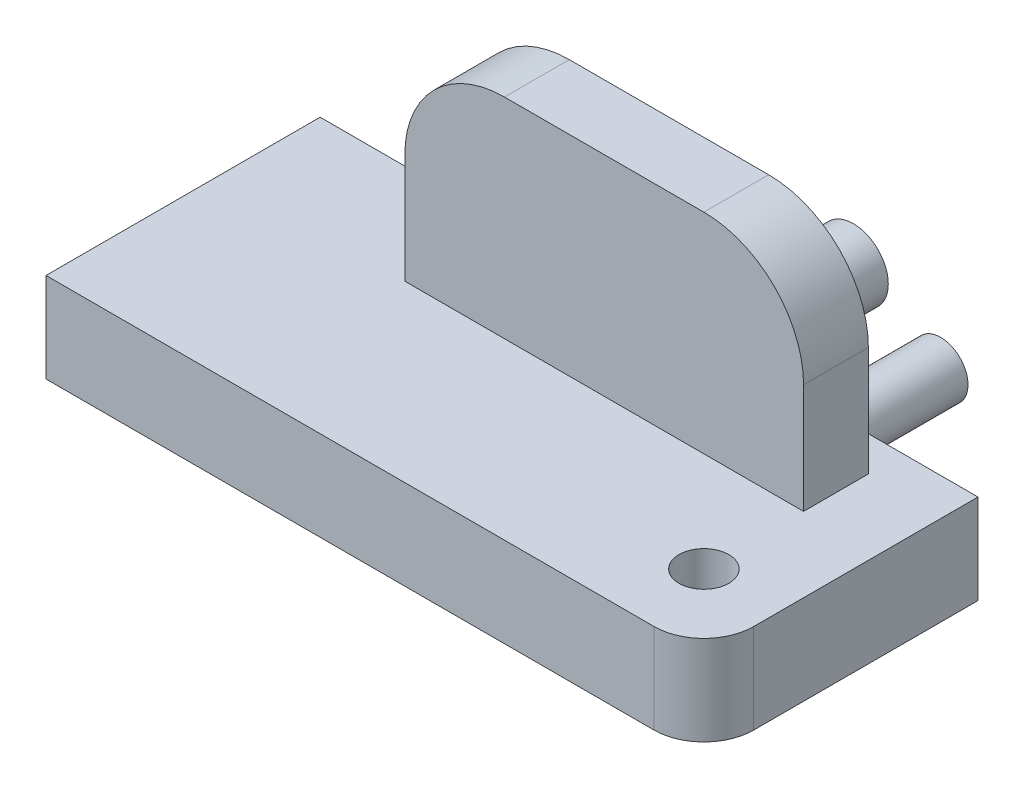
ISO-10303-21;
HEADER;
FILE_DESCRIPTION(('STEP AP214'),'2;1');
FILE_NAME('part.step','',(''),(''),'','','');
FILE_SCHEMA(('AUTOMOTIVE_DESIGN { 1 0 10303 214 1 1 1 1 }'));
ENDSEC;
DATA;
#1=APPLICATION_CONTEXT('core data for automotive mechanical design processes');
#2=APPLICATION_PROTOCOL_DEFINITION('international standard','automotive_design',2000,#1);
#3=PRODUCT_CONTEXT('',#1,'mechanical');
#4=PRODUCT('Part','Part','',(#3));
#5=PRODUCT_RELATED_PRODUCT_CATEGORY('part','',(#4));
#6=PRODUCT_DEFINITION_FORMATION('','',#4);
#7=PRODUCT_DEFINITION_CONTEXT('part definition',#1,'design');
#8=PRODUCT_DEFINITION('design','',#6,#7);
#9=PRODUCT_DEFINITION_SHAPE('','',#8);
#10=(LENGTH_UNIT() NAMED_UNIT(*) SI_UNIT(.MILLI.,.METRE.));
#11=(NAMED_UNIT(*) PLANE_ANGLE_UNIT() SI_UNIT($,.RADIAN.));
#12=(NAMED_UNIT(*) SI_UNIT($,.STERADIAN.) SOLID_ANGLE_UNIT());
#13=UNCERTAINTY_MEASURE_WITH_UNIT(LENGTH_MEASURE(1.E-05),#10,'distance_accuracy_value','');
#14=(GEOMETRIC_REPRESENTATION_CONTEXT(3) GLOBAL_UNCERTAINTY_ASSIGNED_CONTEXT((#13)) GLOBAL_UNIT_ASSIGNED_CONTEXT((#10,
#11,#12)) REPRESENTATION_CONTEXT('',''));
#15=CARTESIAN_POINT('',(0.,0.,0.));
#16=DIRECTION('',(0.,0.,1.));
#17=DIRECTION('',(1.,0.,0.));
#18=AXIS2_PLACEMENT_3D('',#15,#16,#17);
#19=CARTESIAN_POINT('',(50.,8.,-5.));
#20=DIRECTION('',(0.,1.,0.));
#21=DIRECTION('',(0.,0.,1.));
#22=AXIS2_PLACEMENT_3D('',#19,#20,#21);
#23=PLANE('',#22);
#24=DIRECTION('',(-1.,0.,0.));
#25=VECTOR('',#24,1.);
#26=CARTESIAN_POINT('',(0.,8.,-17.5));
#27=LINE('',#26,#25);
#28=CARTESIAN_POINT('',(47.5,8.,-17.5));
#29=VERTEX_POINT('',#28);
#30=CARTESIAN_POINT('',(7.49999999999999,8.,-17.5));
#31=VERTEX_POINT('',#30);
#32=EDGE_CURVE('E195',#29,#31,#27,.T.);
#33=ORIENTED_EDGE('',*,*,#32,.T.);
#34=DIRECTION('',(0.,0.,-1.));
#35=VECTOR('',#34,1.);
#36=CARTESIAN_POINT('',(7.49999999999999,8.,0.));
#37=LINE('',#36,#35);
#38=CARTESIAN_POINT('',(7.49999999999999,8.,-24.));
#39=VERTEX_POINT('',#38);
#40=EDGE_CURVE('E179',#31,#39,#37,.T.);
#41=ORIENTED_EDGE('',*,*,#40,.T.);
#42=DIRECTION('',(-1.,0.,0.));
#43=VECTOR('',#42,1.);
#44=CARTESIAN_POINT('',(0.,8.,-24.));
#45=LINE('',#44,#43);
#46=CARTESIAN_POINT('',(47.5,8.,-24.));
#47=VERTEX_POINT('',#46);
#48=EDGE_CURVE('E193',#47,#39,#45,.T.);
#49=ORIENTED_EDGE('',*,*,#48,.F.);
#50=DIRECTION('',(0.,0.,-1.));
#51=VECTOR('',#50,1.);
#52=CARTESIAN_POINT('',(47.5,8.,0.));
#53=LINE('',#52,#51);
#54=EDGE_CURVE('E172',#29,#47,#53,.T.);
#55=ORIENTED_EDGE('',*,*,#54,.F.);
#56=EDGE_LOOP('',(#33,#41,#49,#55));
#57=FACE_BOUND('',#56,.T.);
#58=DIRECTION('',(1.,0.,0.));
#59=VECTOR('',#58,1.);
#60=CARTESIAN_POINT('',(5.00000000000003,8.,0.));
#61=LINE('',#60,#59);
#62=CARTESIAN_POINT('',(-11.,8.,0.));
#63=VERTEX_POINT('',#62);
#64=CARTESIAN_POINT('',(50.,8.,0.));
#65=VERTEX_POINT('',#64);
#66=EDGE_CURVE('E218',#63,#65,#61,.T.);
#67=ORIENTED_EDGE('',*,*,#66,.T.);
#68=CARTESIAN_POINT('',(50.,8.,-5.));
#69=DIRECTION('',(0.,1.,0.));
#70=DIRECTION('',(0.,0.,1.));
#71=AXIS2_PLACEMENT_3D('',#68,#69,#70);
#72=CIRCLE('',#71,5.);
#73=CARTESIAN_POINT('',(55.,8.,-5.00000000000004));
#74=VERTEX_POINT('',#73);
#75=EDGE_CURVE('E212',#65,#74,#72,.T.);
#76=ORIENTED_EDGE('',*,*,#75,.T.);
#77=DIRECTION('',(0.,0.,-1.));
#78=VECTOR('',#77,1.);
#79=CARTESIAN_POINT('',(55.,8.,-5.00000000000004));
#80=LINE('',#79,#78);
#81=CARTESIAN_POINT('',(55.,8.,-27.5));
#82=VERTEX_POINT('',#81);
#83=EDGE_CURVE('E215',#74,#82,#80,.T.);
#84=ORIENTED_EDGE('',*,*,#83,.T.);
#85=DIRECTION('',(-1.,0.,0.));
#86=VECTOR('',#85,1.);
#87=CARTESIAN_POINT('',(50.,8.,-27.5));
#88=LINE('',#87,#86);
#89=CARTESIAN_POINT('',(-11.,8.,-27.5));
#90=VERTEX_POINT('',#89);
#91=EDGE_CURVE('E233',#82,#90,#88,.T.);
#92=ORIENTED_EDGE('',*,*,#91,.T.);
#93=DIRECTION('',(0.,0.,-1.));
#94=VECTOR('',#93,1.);
#95=CARTESIAN_POINT('',(-11.,8.,-27.5));
#96=LINE('',#95,#94);
#97=EDGE_CURVE('E161',#63,#90,#96,.T.);
#98=ORIENTED_EDGE('',*,*,#97,.F.);
#99=EDGE_LOOP('',(#67,#76,#84,#92,#98));
#100=FACE_BOUND('',#99,.T.);
#101=CARTESIAN_POINT('',(47.5000000000004,8.,-7.5));
#102=DIRECTION('',(0.,1.,0.));
#103=DIRECTION('',(0.,0.,1.));
#104=AXIS2_PLACEMENT_3D('',#101,#102,#103);
#105=CIRCLE('',#104,2.5);
#106=CARTESIAN_POINT('',(47.5000000000004,8.,-5.));
#107=VERTEX_POINT('',#106);
#108=EDGE_CURVE('E146',#107,#107,#105,.T.);
#109=ORIENTED_EDGE('',*,*,#108,.F.);
#110=EDGE_LOOP('',(#109));
#111=FACE_BOUND('',#110,.T.);
#112=ADVANCED_FACE('F49',(#57,#100,#111),#23,.T.);
#113=CARTESIAN_POINT('',(0.,23.,-24.));
#114=DIRECTION('',(0.,0.,1.));
#115=DIRECTION('',(1.,0.,0.));
#116=AXIS2_PLACEMENT_3D('',#113,#114,#115);
#117=PLANE('',#116);
#118=CARTESIAN_POINT('',(17.5,17.,-24.));
#119=DIRECTION('',(0.,0.,1.));
#120=DIRECTION('',(1.,0.,0.));
#121=AXIS2_PLACEMENT_3D('',#118,#119,#120);
#122=CIRCLE('',#121,3.5);
#123=CARTESIAN_POINT('',(21.,17.,-24.));
#124=VERTEX_POINT('',#123);
#125=EDGE_CURVE('E239',#124,#124,#122,.F.);
#126=ORIENTED_EDGE('',*,*,#125,.F.);
#127=EDGE_LOOP('',(#126));
#128=FACE_BOUND('',#127,.T.);
#129=CARTESIAN_POINT('',(37.5,17.,-24.));
#130=DIRECTION('',(0.,0.,1.));
#131=DIRECTION('',(1.,0.,0.));
#132=AXIS2_PLACEMENT_3D('',#129,#130,#131);
#133=CIRCLE('',#132,3.5);
#134=CARTESIAN_POINT('',(41.,17.,-24.));
#135=VERTEX_POINT('',#134);
#136=EDGE_CURVE('E236',#135,#135,#133,.F.);
#137=ORIENTED_EDGE('',*,*,#136,.F.);
#138=EDGE_LOOP('',(#137));
#139=FACE_BOUND('',#138,.T.);
#140=DIRECTION('',(-1.,0.,0.));
#141=VECTOR('',#140,1.);
#142=CARTESIAN_POINT('',(32.,29.,-24.));
#143=LINE('',#142,#141);
#144=CARTESIAN_POINT('',(37.5,29.,-24.));
#145=VERTEX_POINT('',#144);
#146=CARTESIAN_POINT('',(17.5,29.,-24.));
#147=VERTEX_POINT('',#146);
#148=EDGE_CURVE('E187',#145,#147,#143,.T.);
#149=ORIENTED_EDGE('',*,*,#148,.F.);
#150=CARTESIAN_POINT('',(37.5,19.,-24.));
#151=DIRECTION('',(0.,0.,1.));
#152=DIRECTION('',(1.,0.,0.));
#153=AXIS2_PLACEMENT_3D('',#150,#151,#152);
#154=CIRCLE('',#153,10.);
#155=CARTESIAN_POINT('',(47.5,19.,-24.));
#156=VERTEX_POINT('',#155);
#157=EDGE_CURVE('E249',#145,#156,#154,.F.);
#158=ORIENTED_EDGE('',*,*,#157,.T.);
#159=DIRECTION('',(0.,-1.,0.));
#160=VECTOR('',#159,1.);
#161=CARTESIAN_POINT('',(47.5,29.,-24.));
#162=LINE('',#161,#160);
#163=EDGE_CURVE('E177',#156,#47,#162,.T.);
#164=ORIENTED_EDGE('',*,*,#163,.T.);
#165=ORIENTED_EDGE('',*,*,#48,.T.);
#166=DIRECTION('',(0.,-1.,0.));
#167=VECTOR('',#166,1.);
#168=CARTESIAN_POINT('',(7.49999999999999,29.,-24.));
#169=LINE('',#168,#167);
#170=CARTESIAN_POINT('',(7.49999999999999,19.,-24.));
#171=VERTEX_POINT('',#170);
#172=EDGE_CURVE('E182',#171,#39,#169,.T.);
#173=ORIENTED_EDGE('',*,*,#172,.F.);
#174=CARTESIAN_POINT('',(17.5,19.,-24.));
#175=DIRECTION('',(0.,0.,1.));
#176=DIRECTION('',(1.,0.,0.));
#177=AXIS2_PLACEMENT_3D('',#174,#175,#176);
#178=CIRCLE('',#177,10.);
#179=EDGE_CURVE('E247',#171,#147,#178,.F.);
#180=ORIENTED_EDGE('',*,*,#179,.T.);
#181=EDGE_LOOP('',(#149,#158,#164,#165,#173,#180));
#182=FACE_BOUND('',#181,.T.);
#183=ADVANCED_FACE('F263',(#128,#139,#182),#117,.F.);
#184=CARTESIAN_POINT('',(55.,-1.,-5.00000000000004));
#185=DIRECTION('',(1.,0.,0.));
#186=DIRECTION('',(0.,0.,-1.));
#187=AXIS2_PLACEMENT_3D('',#184,#185,#186);
#188=PLANE('',#187);
#189=DIRECTION('',(0.,0.,-1.));
#190=VECTOR('',#189,1.);
#191=CARTESIAN_POINT('',(55.,-1.,-5.00000000000004));
#192=LINE('',#191,#190);
#193=CARTESIAN_POINT('',(55.,-1.,-5.00000000000004));
#194=VERTEX_POINT('',#193);
#195=CARTESIAN_POINT('',(55.,-1.,-27.5));
#196=VERTEX_POINT('',#195);
#197=EDGE_CURVE('E226',#194,#196,#192,.T.);
#198=ORIENTED_EDGE('',*,*,#197,.T.);
#199=DIRECTION('',(0.,-1.,0.));
#200=VECTOR('',#199,1.);
#201=CARTESIAN_POINT('',(55.,26.,-27.5));
#202=LINE('',#201,#200);
#203=EDGE_CURVE('E142',#82,#196,#202,.T.);
#204=ORIENTED_EDGE('',*,*,#203,.F.);
#205=ORIENTED_EDGE('',*,*,#83,.F.);
#206=DIRECTION('',(0.,1.,0.));
#207=VECTOR('',#206,1.);
#208=CARTESIAN_POINT('',(55.,-1.,-5.00000000000004));
#209=LINE('',#208,#207);
#210=EDGE_CURVE('E229',#194,#74,#209,.T.);
#211=ORIENTED_EDGE('',*,*,#210,.F.);
#212=EDGE_LOOP('',(#198,#204,#205,#211));
#213=FACE_BOUND('',#212,.T.);
#214=ADVANCED_FACE('F287',(#213),#188,.T.);
#215=CARTESIAN_POINT('',(50.,-1.,-5.));
#216=DIRECTION('',(0.,1.,0.));
#217=DIRECTION('',(0.,0.,1.));
#218=AXIS2_PLACEMENT_3D('',#215,#216,#217);
#219=PLANE('',#218);
#220=CARTESIAN_POINT('',(47.5000000000004,-1.,-7.5));
#221=DIRECTION('',(0.,1.,0.));
#222=DIRECTION('',(0.,0.,1.));
#223=AXIS2_PLACEMENT_3D('',#220,#221,#222);
#224=CIRCLE('',#223,2.5);
#225=CARTESIAN_POINT('',(47.5000000000004,-1.,-5.));
#226=VERTEX_POINT('',#225);
#227=EDGE_CURVE('E220',#226,#226,#224,.T.);
#228=ORIENTED_EDGE('',*,*,#227,.T.);
#229=EDGE_LOOP('',(#228));
#230=FACE_BOUND('',#229,.T.);
#231=CARTESIAN_POINT('',(50.,-1.,-5.));
#232=DIRECTION('',(0.,1.,0.));
#233=DIRECTION('',(0.,0.,1.));
#234=AXIS2_PLACEMENT_3D('',#231,#232,#233);
#235=CIRCLE('',#234,5.);
#236=CARTESIAN_POINT('',(50.,-1.,0.));
#237=VERTEX_POINT('',#236);
#238=EDGE_CURVE('E223',#237,#194,#235,.T.);
#239=ORIENTED_EDGE('',*,*,#238,.F.);
#240=DIRECTION('',(1.,0.,0.));
#241=VECTOR('',#240,1.);
#242=CARTESIAN_POINT('',(5.00000000000003,-1.,0.));
#243=LINE('',#242,#241);
#244=CARTESIAN_POINT('',(-11.,-1.,0.));
#245=VERTEX_POINT('',#244);
#246=EDGE_CURVE('E152',#245,#237,#243,.T.);
#247=ORIENTED_EDGE('',*,*,#246,.F.);
#248=DIRECTION('',(0.,0.,1.));
#249=VECTOR('',#248,1.);
#250=CARTESIAN_POINT('',(-11.,-1.,-27.5));
#251=LINE('',#250,#249);
#252=CARTESIAN_POINT('',(-11.,-1.,-27.5));
#253=VERTEX_POINT('',#252);
#254=EDGE_CURVE('E149',#253,#245,#251,.T.);
#255=ORIENTED_EDGE('',*,*,#254,.F.);
#256=DIRECTION('',(-1.,0.,0.));
#257=VECTOR('',#256,1.);
#258=CARTESIAN_POINT('',(50.,-1.,-27.5));
#259=LINE('',#258,#257);
#260=EDGE_CURVE('E135',#196,#253,#259,.T.);
#261=ORIENTED_EDGE('',*,*,#260,.F.);
#262=ORIENTED_EDGE('',*,*,#197,.F.);
#263=EDGE_LOOP('',(#239,#247,#255,#261,#262));
#264=FACE_BOUND('',#263,.T.);
#265=ADVANCED_FACE('F151',(#230,#264),#219,.F.);
#266=CARTESIAN_POINT('',(50.,-1.,-5.));
#267=DIRECTION('',(0.,1.,0.));
#268=DIRECTION('',(0.,0.,1.));
#269=AXIS2_PLACEMENT_3D('',#266,#267,#268);
#270=CYLINDRICAL_SURFACE('',#269,5.);
#271=ORIENTED_EDGE('',*,*,#210,.T.);
#272=ORIENTED_EDGE('',*,*,#75,.F.);
#273=DIRECTION('',(0.,1.,0.));
#274=VECTOR('',#273,1.);
#275=CARTESIAN_POINT('',(50.,-1.,0.));
#276=LINE('',#275,#274);
#277=EDGE_CURVE('E230',#237,#65,#276,.T.);
#278=ORIENTED_EDGE('',*,*,#277,.F.);
#279=ORIENTED_EDGE('',*,*,#238,.T.);
#280=EDGE_LOOP('',(#271,#272,#278,#279));
#281=FACE_BOUND('',#280,.T.);
#282=ADVANCED_FACE('F300',(#281),#270,.T.);
#283=CARTESIAN_POINT('',(5.00000000000003,-1.,0.));
#284=DIRECTION('',(0.,0.,1.));
#285=DIRECTION('',(1.,0.,0.));
#286=AXIS2_PLACEMENT_3D('',#283,#284,#285);
#287=PLANE('',#286);
#288=ORIENTED_EDGE('',*,*,#277,.T.);
#289=ORIENTED_EDGE('',*,*,#66,.F.);
#290=DIRECTION('',(0.,1.,0.));
#291=VECTOR('',#290,1.);
#292=CARTESIAN_POINT('',(-11.,-1.,0.));
#293=LINE('',#292,#291);
#294=EDGE_CURVE('E156',#245,#63,#293,.T.);
#295=ORIENTED_EDGE('',*,*,#294,.F.);
#296=ORIENTED_EDGE('',*,*,#246,.T.);
#297=EDGE_LOOP('',(#288,#289,#295,#296));
#298=FACE_BOUND('',#297,.T.);
#299=ADVANCED_FACE('F296',(#298),#287,.T.);
#300=CARTESIAN_POINT('',(47.5000000000004,-1.,-7.5));
#301=DIRECTION('',(0.,1.,0.));
#302=DIRECTION('',(0.,0.,1.));
#303=AXIS2_PLACEMENT_3D('',#300,#301,#302);
#304=CYLINDRICAL_SURFACE('',#303,2.5);
#305=ORIENTED_EDGE('',*,*,#227,.F.);
#306=EDGE_LOOP('',(#305));
#307=FACE_BOUND('',#306,.T.);
#308=ORIENTED_EDGE('',*,*,#108,.T.);
#309=EDGE_LOOP('',(#308));
#310=FACE_BOUND('',#309,.T.);
#311=ADVANCED_FACE('F293',(#307,#310),#304,.F.);
#312=CARTESIAN_POINT('',(0.,26.,-27.5));
#313=DIRECTION('',(0.,0.,-1.));
#314=DIRECTION('',(-1.,0.,0.));
#315=AXIS2_PLACEMENT_3D('',#312,#313,#314);
#316=PLANE('',#315);
#317=ORIENTED_EDGE('',*,*,#260,.T.);
#318=DIRECTION('',(0.,-1.,0.));
#319=VECTOR('',#318,1.);
#320=CARTESIAN_POINT('',(-11.,-1.,-27.5));
#321=LINE('',#320,#319);
#322=EDGE_CURVE('E140',#90,#253,#321,.T.);
#323=ORIENTED_EDGE('',*,*,#322,.F.);
#324=ORIENTED_EDGE('',*,*,#91,.F.);
#325=ORIENTED_EDGE('',*,*,#203,.T.);
#326=EDGE_LOOP('',(#317,#323,#324,#325));
#327=FACE_BOUND('',#326,.T.);
#328=CARTESIAN_POINT('',(17.5,3.5,-27.5));
#329=DIRECTION('',(0.,0.,-1.));
#330=DIRECTION('',(-1.,0.,0.));
#331=AXIS2_PLACEMENT_3D('',#328,#329,#330);
#332=CIRCLE('',#331,2.75);
#333=CARTESIAN_POINT('',(14.75,3.5,-27.5));
#334=VERTEX_POINT('',#333);
#335=EDGE_CURVE('E197',#334,#334,#332,.T.);
#336=ORIENTED_EDGE('',*,*,#335,.F.);
#337=EDGE_LOOP('',(#336));
#338=FACE_BOUND('',#337,.T.);
#339=CARTESIAN_POINT('',(37.5,3.5,-27.5));
#340=DIRECTION('',(0.,0.,-1.));
#341=DIRECTION('',(-1.,0.,0.));
#342=AXIS2_PLACEMENT_3D('',#339,#340,#341);
#343=CIRCLE('',#342,2.75);
#344=CARTESIAN_POINT('',(34.75,3.5,-27.5));
#345=VERTEX_POINT('',#344);
#346=EDGE_CURVE('E201',#345,#345,#343,.T.);
#347=ORIENTED_EDGE('',*,*,#346,.F.);
#348=EDGE_LOOP('',(#347));
#349=FACE_BOUND('',#348,.T.);
#350=ADVANCED_FACE('F137',(#327,#338,#349),#316,.T.);
#351=CARTESIAN_POINT('',(37.5,3.5,-41.25));
#352=DIRECTION('',(0.,0.,1.));
#353=DIRECTION('',(1.,0.,0.));
#354=AXIS2_PLACEMENT_3D('',#351,#352,#353);
#355=CYLINDRICAL_SURFACE('',#354,2.75);
#356=CARTESIAN_POINT('',(37.5,3.5,-41.25));
#357=DIRECTION('',(0.,0.,-1.));
#358=DIRECTION('',(-1.,0.,0.));
#359=AXIS2_PLACEMENT_3D('',#356,#357,#358);
#360=CIRCLE('',#359,2.75);
#361=CARTESIAN_POINT('',(34.75,3.5,-41.25));
#362=VERTEX_POINT('',#361);
#363=EDGE_CURVE('E204',#362,#362,#360,.T.);
#364=ORIENTED_EDGE('',*,*,#363,.F.);
#365=EDGE_LOOP('',(#364));
#366=FACE_BOUND('',#365,.T.);
#367=ORIENTED_EDGE('',*,*,#346,.T.);
#368=EDGE_LOOP('',(#367));
#369=FACE_BOUND('',#368,.T.);
#370=ADVANCED_FACE('F335',(#366,#369),#355,.T.);
#371=CARTESIAN_POINT('',(37.5,3.5,-41.25));
#372=DIRECTION('',(0.,0.,-1.));
#373=DIRECTION('',(-1.,0.,0.));
#374=AXIS2_PLACEMENT_3D('',#371,#372,#373);
#375=PLANE('',#374);
#376=ORIENTED_EDGE('',*,*,#363,.T.);
#377=EDGE_LOOP('',(#376));
#378=FACE_BOUND('',#377,.T.);
#379=ADVANCED_FACE('F342',(#378),#375,.T.);
#380=CARTESIAN_POINT('',(17.5,3.5,-41.25));
#381=DIRECTION('',(0.,0.,1.));
#382=DIRECTION('',(1.,0.,0.));
#383=AXIS2_PLACEMENT_3D('',#380,#381,#382);
#384=CYLINDRICAL_SURFACE('',#383,2.75);
#385=CARTESIAN_POINT('',(17.5,3.5,-41.25));
#386=DIRECTION('',(0.,0.,-1.));
#387=DIRECTION('',(-1.,0.,0.));
#388=AXIS2_PLACEMENT_3D('',#385,#386,#387);
#389=CIRCLE('',#388,2.75);
#390=CARTESIAN_POINT('',(14.75,3.5,-41.25));
#391=VERTEX_POINT('',#390);
#392=EDGE_CURVE('E198',#391,#391,#389,.T.);
#393=ORIENTED_EDGE('',*,*,#392,.F.);
#394=EDGE_LOOP('',(#393));
#395=FACE_BOUND('',#394,.T.);
#396=ORIENTED_EDGE('',*,*,#335,.T.);
#397=EDGE_LOOP('',(#396));
#398=FACE_BOUND('',#397,.T.);
#399=ADVANCED_FACE('F349',(#395,#398),#384,.T.);
#400=CARTESIAN_POINT('',(17.5,3.5,-41.25));
#401=DIRECTION('',(0.,0.,-1.));
#402=DIRECTION('',(-1.,0.,0.));
#403=AXIS2_PLACEMENT_3D('',#400,#401,#402);
#404=PLANE('',#403);
#405=ORIENTED_EDGE('',*,*,#392,.T.);
#406=EDGE_LOOP('',(#405));
#407=FACE_BOUND('',#406,.T.);
#408=ADVANCED_FACE('F357',(#407),#404,.T.);
#409=CARTESIAN_POINT('',(0.,23.,-17.5));
#410=DIRECTION('',(0.,0.,1.));
#411=DIRECTION('',(1.,0.,0.));
#412=AXIS2_PLACEMENT_3D('',#409,#410,#411);
#413=PLANE('',#412);
#414=DIRECTION('',(0.,-1.,0.));
#415=VECTOR('',#414,1.);
#416=CARTESIAN_POINT('',(47.5,29.,-17.5));
#417=LINE('',#416,#415);
#418=CARTESIAN_POINT('',(47.5,19.,-17.5));
#419=VERTEX_POINT('',#418);
#420=EDGE_CURVE('E175',#419,#29,#417,.T.);
#421=ORIENTED_EDGE('',*,*,#420,.F.);
#422=CARTESIAN_POINT('',(37.5,19.,-17.5));
#423=DIRECTION('',(0.,0.,1.));
#424=DIRECTION('',(1.,0.,0.));
#425=AXIS2_PLACEMENT_3D('',#422,#423,#424);
#426=CIRCLE('',#425,10.);
#427=CARTESIAN_POINT('',(37.5,29.,-17.5));
#428=VERTEX_POINT('',#427);
#429=EDGE_CURVE('E57',#419,#428,#426,.T.);
#430=ORIENTED_EDGE('',*,*,#429,.T.);
#431=DIRECTION('',(1.,0.,0.));
#432=VECTOR('',#431,1.);
#433=CARTESIAN_POINT('',(32.,29.,-17.5));
#434=LINE('',#433,#432);
#435=CARTESIAN_POINT('',(17.5,29.,-17.5));
#436=VERTEX_POINT('',#435);
#437=EDGE_CURVE('E190',#436,#428,#434,.T.);
#438=ORIENTED_EDGE('',*,*,#437,.F.);
#439=CARTESIAN_POINT('',(17.5,19.,-17.5));
#440=DIRECTION('',(0.,0.,1.));
#441=DIRECTION('',(1.,0.,0.));
#442=AXIS2_PLACEMENT_3D('',#439,#440,#441);
#443=CIRCLE('',#442,10.);
#444=CARTESIAN_POINT('',(7.49999999999999,19.,-17.5));
#445=VERTEX_POINT('',#444);
#446=EDGE_CURVE('E64',#436,#445,#443,.T.);
#447=ORIENTED_EDGE('',*,*,#446,.T.);
#448=DIRECTION('',(0.,-1.,0.));
#449=VECTOR('',#448,1.);
#450=CARTESIAN_POINT('',(7.49999999999999,29.,-17.5));
#451=LINE('',#450,#449);
#452=EDGE_CURVE('E185',#445,#31,#451,.T.);
#453=ORIENTED_EDGE('',*,*,#452,.T.);
#454=ORIENTED_EDGE('',*,*,#32,.F.);
#455=EDGE_LOOP('',(#421,#430,#438,#447,#453,#454));
#456=FACE_BOUND('',#455,.T.);
#457=ADVANCED_FACE('F253',(#456),#413,.T.);
#458=CARTESIAN_POINT('',(0.,29.,0.));
#459=DIRECTION('',(0.,-1.,0.));
#460=DIRECTION('',(0.,0.,-1.));
#461=AXIS2_PLACEMENT_3D('',#458,#459,#460);
#462=PLANE('',#461);
#463=ORIENTED_EDGE('',*,*,#437,.T.);
#464=DIRECTION('',(0.,0.,-1.));
#465=VECTOR('',#464,1.);
#466=CARTESIAN_POINT('',(37.5,29.,0.));
#467=LINE('',#466,#465);
#468=EDGE_CURVE('E244',#428,#145,#467,.T.);
#469=ORIENTED_EDGE('',*,*,#468,.T.);
#470=ORIENTED_EDGE('',*,*,#148,.T.);
#471=DIRECTION('',(0.,0.,-1.));
#472=VECTOR('',#471,1.);
#473=CARTESIAN_POINT('',(17.5,29.,-17.5));
#474=LINE('',#473,#472);
#475=EDGE_CURVE('E242',#147,#436,#474,.F.);
#476=ORIENTED_EDGE('',*,*,#475,.T.);
#477=EDGE_LOOP('',(#463,#469,#470,#476));
#478=FACE_BOUND('',#477,.T.);
#479=ADVANCED_FACE('F258',(#478),#462,.F.);
#480=CARTESIAN_POINT('',(7.49999999999999,29.,0.));
#481=DIRECTION('',(-1.,0.,0.));
#482=DIRECTION('',(0.,0.,1.));
#483=AXIS2_PLACEMENT_3D('',#480,#481,#482);
#484=PLANE('',#483);
#485=ORIENTED_EDGE('',*,*,#452,.F.);
#486=DIRECTION('',(0.,0.,-1.));
#487=VECTOR('',#486,1.);
#488=CARTESIAN_POINT('',(7.49999999999999,19.,-24.));
#489=LINE('',#488,#487);
#490=EDGE_CURVE('E12',#445,#171,#489,.T.);
#491=ORIENTED_EDGE('',*,*,#490,.T.);
#492=ORIENTED_EDGE('',*,*,#172,.T.);
#493=ORIENTED_EDGE('',*,*,#40,.F.);
#494=EDGE_LOOP('',(#485,#491,#492,#493));
#495=FACE_BOUND('',#494,.T.);
#496=ADVANCED_FACE('F272',(#495),#484,.T.);
#497=CARTESIAN_POINT('',(47.5,29.,0.));
#498=DIRECTION('',(-1.,0.,0.));
#499=DIRECTION('',(0.,0.,1.));
#500=AXIS2_PLACEMENT_3D('',#497,#498,#499);
#501=PLANE('',#500);
#502=ORIENTED_EDGE('',*,*,#163,.F.);
#503=DIRECTION('',(0.,0.,-1.));
#504=VECTOR('',#503,1.);
#505=CARTESIAN_POINT('',(47.5,19.,0.));
#506=LINE('',#505,#504);
#507=EDGE_CURVE('E72',#156,#419,#506,.F.);
#508=ORIENTED_EDGE('',*,*,#507,.T.);
#509=ORIENTED_EDGE('',*,*,#420,.T.);
#510=ORIENTED_EDGE('',*,*,#54,.T.);
#511=EDGE_LOOP('',(#502,#508,#509,#510));
#512=FACE_BOUND('',#511,.T.);
#513=ADVANCED_FACE('F265',(#512),#501,.F.);
#514=CARTESIAN_POINT('',(37.5,17.,-32.5));
#515=DIRECTION('',(0.,0.,1.));
#516=DIRECTION('',(1.,0.,0.));
#517=AXIS2_PLACEMENT_3D('',#514,#515,#516);
#518=CYLINDRICAL_SURFACE('',#517,3.5);
#519=CARTESIAN_POINT('',(37.5,17.,-32.5));
#520=DIRECTION('',(0.,0.,-1.));
#521=DIRECTION('',(-1.,0.,0.));
#522=AXIS2_PLACEMENT_3D('',#519,#520,#521);
#523=CIRCLE('',#522,3.5);
#524=CARTESIAN_POINT('',(34.,17.,-32.5));
#525=VERTEX_POINT('',#524);
#526=EDGE_CURVE('E169',#525,#525,#523,.T.);
#527=ORIENTED_EDGE('',*,*,#526,.F.);
#528=EDGE_LOOP('',(#527));
#529=FACE_BOUND('',#528,.T.);
#530=ORIENTED_EDGE('',*,*,#136,.T.);
#531=EDGE_LOOP('',(#530));
#532=FACE_BOUND('',#531,.T.);
#533=ADVANCED_FACE('F392',(#529,#532),#518,.T.);
#534=CARTESIAN_POINT('',(0.,0.,-32.5));
#535=DIRECTION('',(0.,0.,-1.));
#536=DIRECTION('',(-1.,0.,0.));
#537=AXIS2_PLACEMENT_3D('',#534,#535,#536);
#538=PLANE('',#537);
#539=ORIENTED_EDGE('',*,*,#526,.T.);
#540=EDGE_LOOP('',(#539));
#541=FACE_BOUND('',#540,.T.);
#542=ADVANCED_FACE('F399',(#541),#538,.T.);
#543=CARTESIAN_POINT('',(17.5,17.,-32.5));
#544=DIRECTION('',(0.,0.,1.));
#545=DIRECTION('',(1.,0.,0.));
#546=AXIS2_PLACEMENT_3D('',#543,#544,#545);
#547=CYLINDRICAL_SURFACE('',#546,3.5);
#548=ORIENTED_EDGE('',*,*,#125,.T.);
#549=EDGE_LOOP('',(#548));
#550=FACE_BOUND('',#549,.T.);
#551=CARTESIAN_POINT('',(17.5,17.,-32.5));
#552=DIRECTION('',(0.,0.,-1.));
#553=DIRECTION('',(-1.,0.,0.));
#554=AXIS2_PLACEMENT_3D('',#551,#552,#553);
#555=CIRCLE('',#554,3.5);
#556=CARTESIAN_POINT('',(14.,17.,-32.5));
#557=VERTEX_POINT('',#556);
#558=EDGE_CURVE('E166',#557,#557,#555,.T.);
#559=ORIENTED_EDGE('',*,*,#558,.F.);
#560=EDGE_LOOP('',(#559));
#561=FACE_BOUND('',#560,.T.);
#562=ADVANCED_FACE('F407',(#550,#561),#547,.T.);
#563=CARTESIAN_POINT('',(0.,0.,-32.5));
#564=DIRECTION('',(0.,0.,-1.));
#565=DIRECTION('',(-1.,0.,0.));
#566=AXIS2_PLACEMENT_3D('',#563,#564,#565);
#567=PLANE('',#566);
#568=ORIENTED_EDGE('',*,*,#558,.T.);
#569=EDGE_LOOP('',(#568));
#570=FACE_BOUND('',#569,.T.);
#571=ADVANCED_FACE('F281',(#570),#567,.T.);
#572=CARTESIAN_POINT('',(37.5,19.,0.));
#573=DIRECTION('',(0.,0.,-1.));
#574=DIRECTION('',(-1.,0.,0.));
#575=AXIS2_PLACEMENT_3D('',#572,#573,#574);
#576=CYLINDRICAL_SURFACE('',#575,10.);
#577=ORIENTED_EDGE('',*,*,#429,.F.);
#578=ORIENTED_EDGE('',*,*,#507,.F.);
#579=ORIENTED_EDGE('',*,*,#157,.F.);
#580=ORIENTED_EDGE('',*,*,#468,.F.);
#581=EDGE_LOOP('',(#577,#578,#579,#580));
#582=FACE_BOUND('',#581,.T.);
#583=ADVANCED_FACE('F261',(#582),#576,.T.);
#584=CARTESIAN_POINT('',(17.5,19.,0.));
#585=DIRECTION('',(0.,0.,1.));
#586=DIRECTION('',(1.,0.,0.));
#587=AXIS2_PLACEMENT_3D('',#584,#585,#586);
#588=CYLINDRICAL_SURFACE('',#587,10.);
#589=ORIENTED_EDGE('',*,*,#446,.F.);
#590=ORIENTED_EDGE('',*,*,#475,.F.);
#591=ORIENTED_EDGE('',*,*,#179,.F.);
#592=ORIENTED_EDGE('',*,*,#490,.F.);
#593=EDGE_LOOP('',(#589,#590,#591,#592));
#594=FACE_BOUND('',#593,.T.);
#595=ADVANCED_FACE('F51',(#594),#588,.T.);
#596=CARTESIAN_POINT('',(-11.,0.,0.));
#597=DIRECTION('',(1.,0.,0.));
#598=DIRECTION('',(0.,0.,-1.));
#599=AXIS2_PLACEMENT_3D('',#596,#597,#598);
#600=PLANE('',#599);
#601=ORIENTED_EDGE('',*,*,#322,.T.);
#602=ORIENTED_EDGE('',*,*,#254,.T.);
#603=ORIENTED_EDGE('',*,*,#294,.T.);
#604=ORIENTED_EDGE('',*,*,#97,.T.);
#605=EDGE_LOOP('',(#601,#602,#603,#604));
#606=FACE_BOUND('',#605,.T.);
#607=ADVANCED_FACE('F159',(#606),#600,.F.);
#608=CLOSED_SHELL('',(#112,#183,#214,#265,#282,#299,#311,#350,#370,#379,#399,#408,#457,#479,
#496,#513,#533,#542,#562,#571,#583,#595,#607));
#609=MANIFOLD_SOLID_BREP('B2',#608);
#610=ADVANCED_BREP_SHAPE_REPRESENTATION('',(#18,#609),#14);
#611=SHAPE_DEFINITION_REPRESENTATION(#9,#610);
ENDSEC;
END-ISO-10303-21;
